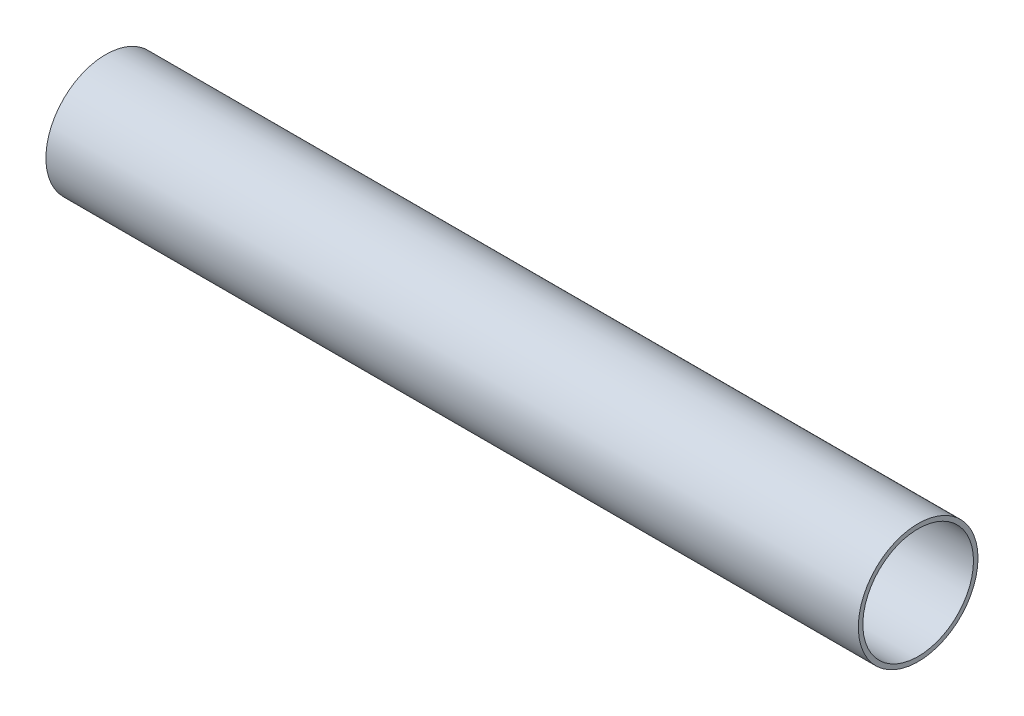
ISO-10303-21;
HEADER;
FILE_DESCRIPTION(('STEP AP214'),'2;1');
FILE_NAME('part.step','',(''),(''),'','','');
FILE_SCHEMA(('AUTOMOTIVE_DESIGN { 1 0 10303 214 1 1 1 1 }'));
ENDSEC;
DATA;
#1=APPLICATION_CONTEXT('core data for automotive mechanical design processes');
#2=APPLICATION_PROTOCOL_DEFINITION('international standard','automotive_design',2000,#1);
#3=PRODUCT_CONTEXT('',#1,'mechanical');
#4=PRODUCT('Part','Part','',(#3));
#5=PRODUCT_RELATED_PRODUCT_CATEGORY('part','',(#4));
#6=PRODUCT_DEFINITION_FORMATION('','',#4);
#7=PRODUCT_DEFINITION_CONTEXT('part definition',#1,'design');
#8=PRODUCT_DEFINITION('design','',#6,#7);
#9=PRODUCT_DEFINITION_SHAPE('','',#8);
#10=(LENGTH_UNIT() NAMED_UNIT(*) SI_UNIT(.MILLI.,.METRE.));
#11=(NAMED_UNIT(*) PLANE_ANGLE_UNIT() SI_UNIT($,.RADIAN.));
#12=(NAMED_UNIT(*) SI_UNIT($,.STERADIAN.) SOLID_ANGLE_UNIT());
#13=UNCERTAINTY_MEASURE_WITH_UNIT(LENGTH_MEASURE(1.E-05),#10,'distance_accuracy_value','');
#14=(GEOMETRIC_REPRESENTATION_CONTEXT(3) GLOBAL_UNCERTAINTY_ASSIGNED_CONTEXT((#13)) GLOBAL_UNIT_ASSIGNED_CONTEXT((#10,
#11,#12)) REPRESENTATION_CONTEXT('',''));
#15=CARTESIAN_POINT('',(0.,0.,0.));
#16=DIRECTION('',(0.,0.,1.));
#17=DIRECTION('',(1.,0.,0.));
#18=AXIS2_PLACEMENT_3D('',#15,#16,#17);
#19=CARTESIAN_POINT('',(116.571624997,0.,0.));
#20=DIRECTION('',(1.,0.,0.));
#21=DIRECTION('',(0.,0.,-1.));
#22=AXIS2_PLACEMENT_3D('',#19,#20,#21);
#23=PLANE('',#22);
#24=CARTESIAN_POINT('',(116.571624997,0.,0.));
#25=DIRECTION('',(1.,0.,0.));
#26=DIRECTION('',(0.,0.,-1.));
#27=AXIS2_PLACEMENT_3D('',#24,#25,#26);
#28=CIRCLE('',#27,17.1714379493972);
#29=CARTESIAN_POINT('',(116.571624997,0.,-17.1714379493972));
#30=VERTEX_POINT('',#29);
#31=EDGE_CURVE('E10',#30,#30,#28,.T.);
#32=ORIENTED_EDGE('',*,*,#31,.T.);
#33=EDGE_LOOP('',(#32));
#34=FACE_BOUND('',#33,.T.);
#35=CARTESIAN_POINT('',(116.571624997,0.,0.));
#36=DIRECTION('',(1.,0.,0.));
#37=DIRECTION('',(0.,0.,-1.));
#38=AXIS2_PLACEMENT_3D('',#35,#36,#37);
#39=CIRCLE('',#38,15.875);
#40=CARTESIAN_POINT('',(116.571624997,0.,-15.875));
#41=VERTEX_POINT('',#40);
#42=EDGE_CURVE('E46',#41,#41,#39,.T.);
#43=ORIENTED_EDGE('',*,*,#42,.F.);
#44=EDGE_LOOP('',(#43));
#45=FACE_BOUND('',#44,.T.);
#46=ADVANCED_FACE('F35',(#34,#45),#23,.T.);
#47=CARTESIAN_POINT('',(-116.571624997,0.,0.));
#48=DIRECTION('',(1.,0.,0.));
#49=DIRECTION('',(0.,0.,-1.));
#50=AXIS2_PLACEMENT_3D('',#47,#48,#49);
#51=PLANE('',#50);
#52=CARTESIAN_POINT('',(-116.571624997,0.,0.));
#53=DIRECTION('',(1.,0.,0.));
#54=DIRECTION('',(0.,0.,-1.));
#55=AXIS2_PLACEMENT_3D('',#52,#53,#54);
#56=CIRCLE('',#55,17.1714379493972);
#57=CARTESIAN_POINT('',(-116.571624997,0.,-17.1714379493972));
#58=VERTEX_POINT('',#57);
#59=EDGE_CURVE('E39',#58,#58,#56,.T.);
#60=ORIENTED_EDGE('',*,*,#59,.F.);
#61=EDGE_LOOP('',(#60));
#62=FACE_BOUND('',#61,.T.);
#63=CARTESIAN_POINT('',(-116.571624997,0.,0.));
#64=DIRECTION('',(1.,0.,0.));
#65=DIRECTION('',(0.,0.,-1.));
#66=AXIS2_PLACEMENT_3D('',#63,#64,#65);
#67=CIRCLE('',#66,15.875);
#68=CARTESIAN_POINT('',(-116.571624997,0.,-15.875));
#69=VERTEX_POINT('',#68);
#70=EDGE_CURVE('E48',#69,#69,#67,.T.);
#71=ORIENTED_EDGE('',*,*,#70,.T.);
#72=EDGE_LOOP('',(#71));
#73=FACE_BOUND('',#72,.T.);
#74=ADVANCED_FACE('F58',(#62,#73),#51,.F.);
#75=CARTESIAN_POINT('',(116.571624997,0.,0.));
#76=DIRECTION('',(-1.,0.,0.));
#77=DIRECTION('',(0.,0.,1.));
#78=AXIS2_PLACEMENT_3D('',#75,#76,#77);
#79=CYLINDRICAL_SURFACE('',#78,17.1714379493972);
#80=ORIENTED_EDGE('',*,*,#31,.F.);
#81=EDGE_LOOP('',(#80));
#82=FACE_BOUND('',#81,.T.);
#83=ORIENTED_EDGE('',*,*,#59,.T.);
#84=EDGE_LOOP('',(#83));
#85=FACE_BOUND('',#84,.T.);
#86=ADVANCED_FACE('F37',(#82,#85),#79,.T.);
#87=CARTESIAN_POINT('',(116.571624997,0.,0.));
#88=DIRECTION('',(-1.,0.,0.));
#89=DIRECTION('',(0.,0.,1.));
#90=AXIS2_PLACEMENT_3D('',#87,#88,#89);
#91=CYLINDRICAL_SURFACE('',#90,15.875);
#92=ORIENTED_EDGE('',*,*,#42,.T.);
#93=EDGE_LOOP('',(#92));
#94=FACE_BOUND('',#93,.T.);
#95=ORIENTED_EDGE('',*,*,#70,.F.);
#96=EDGE_LOOP('',(#95));
#97=FACE_BOUND('',#96,.T.);
#98=ADVANCED_FACE('F54',(#94,#97),#91,.F.);
#99=CLOSED_SHELL('',(#46,#74,#86,#98));
#100=MANIFOLD_SOLID_BREP('B2',#99);
#101=ADVANCED_BREP_SHAPE_REPRESENTATION('',(#18,#100),#14);
#102=SHAPE_DEFINITION_REPRESENTATION(#9,#101);
ENDSEC;
END-ISO-10303-21;
